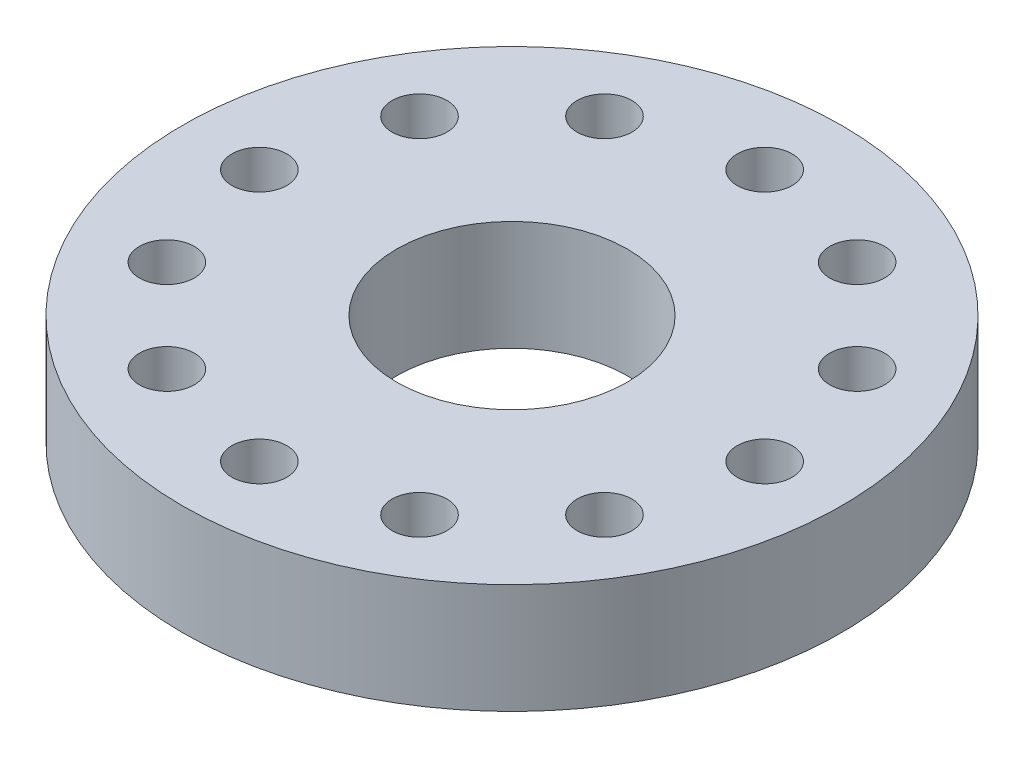
ISO-10303-21;
HEADER;
FILE_DESCRIPTION(('STEP AP214'),'2;1');
FILE_NAME('part.step','',(''),(''),'','','');
FILE_SCHEMA(('AUTOMOTIVE_DESIGN { 1 0 10303 214 1 1 1 1 }'));
ENDSEC;
DATA;
#1=APPLICATION_CONTEXT('core data for automotive mechanical design processes');
#2=APPLICATION_PROTOCOL_DEFINITION('international standard','automotive_design',2000,#1);
#3=PRODUCT_CONTEXT('',#1,'mechanical');
#4=PRODUCT('Part','Part','',(#3));
#5=PRODUCT_RELATED_PRODUCT_CATEGORY('part','',(#4));
#6=PRODUCT_DEFINITION_FORMATION('','',#4);
#7=PRODUCT_DEFINITION_CONTEXT('part definition',#1,'design');
#8=PRODUCT_DEFINITION('design','',#6,#7);
#9=PRODUCT_DEFINITION_SHAPE('','',#8);
#10=(LENGTH_UNIT() NAMED_UNIT(*) SI_UNIT(.MILLI.,.METRE.));
#11=(NAMED_UNIT(*) PLANE_ANGLE_UNIT() SI_UNIT($,.RADIAN.));
#12=(NAMED_UNIT(*) SI_UNIT($,.STERADIAN.) SOLID_ANGLE_UNIT());
#13=UNCERTAINTY_MEASURE_WITH_UNIT(LENGTH_MEASURE(1.E-05),#10,'distance_accuracy_value','');
#14=(GEOMETRIC_REPRESENTATION_CONTEXT(3) GLOBAL_UNCERTAINTY_ASSIGNED_CONTEXT((#13)) GLOBAL_UNIT_ASSIGNED_CONTEXT((#10,
#11,#12)) REPRESENTATION_CONTEXT('',''));
#15=CARTESIAN_POINT('',(0.,0.,0.));
#16=DIRECTION('',(0.,0.,1.));
#17=DIRECTION('',(1.,0.,0.));
#18=AXIS2_PLACEMENT_3D('',#15,#16,#17);
#19=CARTESIAN_POINT('',(0.,10.,0.));
#20=DIRECTION('',(0.,1.,0.));
#21=DIRECTION('',(0.,0.,1.));
#22=AXIS2_PLACEMENT_3D('',#19,#20,#21);
#23=PLANE('',#22);
#24=CARTESIAN_POINT('',(-19.9185842870416,10.,-11.499999999999));
#25=DIRECTION('',(0.,1.,0.));
#26=DIRECTION('',(0.,0.,1.));
#27=AXIS2_PLACEMENT_3D('',#24,#25,#26);
#28=CIRCLE('',#27,2.5);
#29=CARTESIAN_POINT('',(-19.9185842870416,10.,-8.99999999999905));
#30=VERTEX_POINT('',#29);
#31=EDGE_CURVE('E109',#30,#30,#28,.T.);
#32=ORIENTED_EDGE('',*,*,#31,.F.);
#33=EDGE_LOOP('',(#32));
#34=FACE_BOUND('',#33,.T.);
#35=CARTESIAN_POINT('',(-19.9185842870405,10.,11.5000000000009));
#36=DIRECTION('',(0.,1.,0.));
#37=DIRECTION('',(0.,0.,1.));
#38=AXIS2_PLACEMENT_3D('',#35,#36,#37);
#39=CIRCLE('',#38,2.5);
#40=CARTESIAN_POINT('',(-19.9185842870405,10.,14.0000000000009));
#41=VERTEX_POINT('',#40);
#42=EDGE_CURVE('E97',#41,#41,#39,.T.);
#43=ORIENTED_EDGE('',*,*,#42,.F.);
#44=EDGE_LOOP('',(#43));
#45=FACE_BOUND('',#44,.T.);
#46=CARTESIAN_POINT('',(2.16458606171264E-12,10.,23.));
#47=DIRECTION('',(0.,1.,0.));
#48=DIRECTION('',(0.,0.,1.));
#49=AXIS2_PLACEMENT_3D('',#46,#47,#48);
#50=CIRCLE('',#49,2.5);
#51=CARTESIAN_POINT('',(2.16458606171264E-12,10.,25.5));
#52=VERTEX_POINT('',#51);
#53=EDGE_CURVE('E85',#52,#52,#50,.T.);
#54=ORIENTED_EDGE('',*,*,#53,.F.);
#55=EDGE_LOOP('',(#54));
#56=FACE_BOUND('',#55,.T.);
#57=CARTESIAN_POINT('',(19.9185842870437,10.,11.4999999999991));
#58=DIRECTION('',(0.,1.,0.));
#59=DIRECTION('',(0.,0.,1.));
#60=AXIS2_PLACEMENT_3D('',#57,#58,#59);
#61=CIRCLE('',#60,2.5);
#62=CARTESIAN_POINT('',(19.9185842870437,10.,13.9999999999991));
#63=VERTEX_POINT('',#62);
#64=EDGE_CURVE('E73',#63,#63,#61,.T.);
#65=ORIENTED_EDGE('',*,*,#64,.F.);
#66=EDGE_LOOP('',(#65));
#67=FACE_BOUND('',#66,.T.);
#68=CARTESIAN_POINT('',(19.9185842870426,10.,-11.5000000000009));
#69=DIRECTION('',(0.,1.,0.));
#70=DIRECTION('',(0.,0.,1.));
#71=AXIS2_PLACEMENT_3D('',#68,#69,#70);
#72=CIRCLE('',#71,2.49999999999999);
#73=CARTESIAN_POINT('',(19.9185842870426,10.,-9.00000000000095));
#74=VERTEX_POINT('',#73);
#75=EDGE_CURVE('E61',#74,#74,#72,.T.);
#76=ORIENTED_EDGE('',*,*,#75,.F.);
#77=EDGE_LOOP('',(#76));
#78=FACE_BOUND('',#77,.T.);
#79=CARTESIAN_POINT('',(0.,10.,0.));
#80=DIRECTION('',(0.,1.,0.));
#81=DIRECTION('',(0.,0.,1.));
#82=AXIS2_PLACEMENT_3D('',#79,#80,#81);
#83=CIRCLE('',#82,10.5);
#84=CARTESIAN_POINT('',(0.,10.,10.5));
#85=VERTEX_POINT('',#84);
#86=EDGE_CURVE('E49',#85,#85,#83,.T.);
#87=ORIENTED_EDGE('',*,*,#86,.F.);
#88=EDGE_LOOP('',(#87));
#89=FACE_BOUND('',#88,.T.);
#90=CARTESIAN_POINT('',(0.,10.,0.));
#91=DIRECTION('',(0.,1.,0.));
#92=DIRECTION('',(0.,0.,1.));
#93=AXIS2_PLACEMENT_3D('',#90,#91,#92);
#94=CIRCLE('',#93,30.);
#95=CARTESIAN_POINT('',(0.,10.,30.));
#96=VERTEX_POINT('',#95);
#97=EDGE_CURVE('E10',#96,#96,#94,.T.);
#98=ORIENTED_EDGE('',*,*,#97,.T.);
#99=EDGE_LOOP('',(#98));
#100=FACE_BOUND('',#99,.T.);
#101=CARTESIAN_POINT('',(0.,10.,-23.));
#102=DIRECTION('',(0.,1.,0.));
#103=DIRECTION('',(0.,0.,1.));
#104=AXIS2_PLACEMENT_3D('',#101,#102,#103);
#105=CIRCLE('',#104,2.5);
#106=CARTESIAN_POINT('',(0.,10.,-20.5));
#107=VERTEX_POINT('',#106);
#108=EDGE_CURVE('E44',#107,#107,#105,.T.);
#109=ORIENTED_EDGE('',*,*,#108,.F.);
#110=EDGE_LOOP('',(#109));
#111=FACE_BOUND('',#110,.T.);
#112=CARTESIAN_POINT('',(11.5000000000001,10.,-19.9185842870426));
#113=DIRECTION('',(0.,1.,0.));
#114=DIRECTION('',(0.,0.,1.));
#115=AXIS2_PLACEMENT_3D('',#112,#113,#114);
#116=CIRCLE('',#115,2.5);
#117=CARTESIAN_POINT('',(11.5000000000001,10.,-17.4185842870426));
#118=VERTEX_POINT('',#117);
#119=EDGE_CURVE('E55',#118,#118,#116,.T.);
#120=ORIENTED_EDGE('',*,*,#119,.F.);
#121=EDGE_LOOP('',(#120));
#122=FACE_BOUND('',#121,.T.);
#123=CARTESIAN_POINT('',(23.0000000000011,10.,-1.08229303085632E-12));
#124=DIRECTION('',(0.,1.,0.));
#125=DIRECTION('',(0.,0.,1.));
#126=AXIS2_PLACEMENT_3D('',#123,#124,#125);
#127=CIRCLE('',#126,2.5);
#128=CARTESIAN_POINT('',(23.0000000000011,10.,2.49999999999892));
#129=VERTEX_POINT('',#128);
#130=EDGE_CURVE('E67',#129,#129,#127,.T.);
#131=ORIENTED_EDGE('',*,*,#130,.F.);
#132=EDGE_LOOP('',(#131));
#133=FACE_BOUND('',#132,.T.);
#134=CARTESIAN_POINT('',(11.500000000002,10.,19.9185842870415));
#135=DIRECTION('',(0.,1.,0.));
#136=DIRECTION('',(0.,0.,1.));
#137=AXIS2_PLACEMENT_3D('',#134,#135,#136);
#138=CIRCLE('',#137,2.5);
#139=CARTESIAN_POINT('',(11.500000000002,10.,22.4185842870415));
#140=VERTEX_POINT('',#139);
#141=EDGE_CURVE('E79',#140,#140,#138,.T.);
#142=ORIENTED_EDGE('',*,*,#141,.F.);
#143=EDGE_LOOP('',(#142));
#144=FACE_BOUND('',#143,.T.);
#145=CARTESIAN_POINT('',(-11.499999999998,10.,19.9185842870426));
#146=DIRECTION('',(0.,1.,0.));
#147=DIRECTION('',(0.,0.,1.));
#148=AXIS2_PLACEMENT_3D('',#145,#146,#147);
#149=CIRCLE('',#148,2.5);
#150=CARTESIAN_POINT('',(-11.499999999998,10.,22.4185842870426));
#151=VERTEX_POINT('',#150);
#152=EDGE_CURVE('E91',#151,#151,#149,.T.);
#153=ORIENTED_EDGE('',*,*,#152,.F.);
#154=EDGE_LOOP('',(#153));
#155=FACE_BOUND('',#154,.T.);
#156=CARTESIAN_POINT('',(-22.9999999999989,10.,1.08510971849436E-12));
#157=DIRECTION('',(0.,1.,0.));
#158=DIRECTION('',(0.,0.,1.));
#159=AXIS2_PLACEMENT_3D('',#156,#157,#158);
#160=CIRCLE('',#159,2.5);
#161=CARTESIAN_POINT('',(-22.9999999999989,10.,2.50000000000108));
#162=VERTEX_POINT('',#161);
#163=EDGE_CURVE('E103',#162,#162,#160,.T.);
#164=ORIENTED_EDGE('',*,*,#163,.F.);
#165=EDGE_LOOP('',(#164));
#166=FACE_BOUND('',#165,.T.);
#167=CARTESIAN_POINT('',(-11.4999999999999,10.,-19.9185842870415));
#168=DIRECTION('',(0.,1.,0.));
#169=DIRECTION('',(0.,0.,1.));
#170=AXIS2_PLACEMENT_3D('',#167,#168,#169);
#171=CIRCLE('',#170,2.5);
#172=CARTESIAN_POINT('',(-11.4999999999999,10.,-17.4185842870415));
#173=VERTEX_POINT('',#172);
#174=EDGE_CURVE('E115',#173,#173,#171,.T.);
#175=ORIENTED_EDGE('',*,*,#174,.F.);
#176=EDGE_LOOP('',(#175));
#177=FACE_BOUND('',#176,.T.);
#178=ADVANCED_FACE('F33',(#34,#45,#56,#67,#78,#89,#100,#111,#122,#133,#144,#155,#166,#177),#23,.T.);
#179=CARTESIAN_POINT('',(0.,0.,0.));
#180=DIRECTION('',(0.,1.,0.));
#181=DIRECTION('',(0.,0.,1.));
#182=AXIS2_PLACEMENT_3D('',#179,#180,#181);
#183=PLANE('',#182);
#184=CARTESIAN_POINT('',(0.,0.,0.));
#185=DIRECTION('',(0.,1.,0.));
#186=DIRECTION('',(0.,0.,1.));
#187=AXIS2_PLACEMENT_3D('',#184,#185,#186);
#188=CIRCLE('',#187,30.);
#189=CARTESIAN_POINT('',(0.,0.,30.));
#190=VERTEX_POINT('',#189);
#191=EDGE_CURVE('E37',#190,#190,#188,.T.);
#192=ORIENTED_EDGE('',*,*,#191,.F.);
#193=EDGE_LOOP('',(#192));
#194=FACE_BOUND('',#193,.T.);
#195=CARTESIAN_POINT('',(0.,0.,-23.));
#196=DIRECTION('',(0.,1.,0.));
#197=DIRECTION('',(0.,0.,1.));
#198=AXIS2_PLACEMENT_3D('',#195,#196,#197);
#199=CIRCLE('',#198,2.5);
#200=CARTESIAN_POINT('',(0.,0.,-20.5));
#201=VERTEX_POINT('',#200);
#202=EDGE_CURVE('E46',#201,#201,#199,.T.);
#203=ORIENTED_EDGE('',*,*,#202,.T.);
#204=EDGE_LOOP('',(#203));
#205=FACE_BOUND('',#204,.T.);
#206=CARTESIAN_POINT('',(0.,0.,0.));
#207=DIRECTION('',(0.,1.,0.));
#208=DIRECTION('',(0.,0.,1.));
#209=AXIS2_PLACEMENT_3D('',#206,#207,#208);
#210=CIRCLE('',#209,10.5);
#211=CARTESIAN_POINT('',(0.,0.,10.5));
#212=VERTEX_POINT('',#211);
#213=EDGE_CURVE('E52',#212,#212,#210,.T.);
#214=ORIENTED_EDGE('',*,*,#213,.T.);
#215=EDGE_LOOP('',(#214));
#216=FACE_BOUND('',#215,.T.);
#217=CARTESIAN_POINT('',(11.5000000000001,0.,-19.9185842870426));
#218=DIRECTION('',(0.,1.,0.));
#219=DIRECTION('',(0.,0.,1.));
#220=AXIS2_PLACEMENT_3D('',#217,#218,#219);
#221=CIRCLE('',#220,2.5);
#222=CARTESIAN_POINT('',(11.5000000000001,0.,-17.4185842870426));
#223=VERTEX_POINT('',#222);
#224=EDGE_CURVE('E58',#223,#223,#221,.T.);
#225=ORIENTED_EDGE('',*,*,#224,.T.);
#226=EDGE_LOOP('',(#225));
#227=FACE_BOUND('',#226,.T.);
#228=CARTESIAN_POINT('',(19.9185842870426,0.,-11.5000000000009));
#229=DIRECTION('',(0.,1.,0.));
#230=DIRECTION('',(0.,0.,1.));
#231=AXIS2_PLACEMENT_3D('',#228,#229,#230);
#232=CIRCLE('',#231,2.49999999999999);
#233=CARTESIAN_POINT('',(19.9185842870426,0.,-9.00000000000095));
#234=VERTEX_POINT('',#233);
#235=EDGE_CURVE('E64',#234,#234,#232,.T.);
#236=ORIENTED_EDGE('',*,*,#235,.T.);
#237=EDGE_LOOP('',(#236));
#238=FACE_BOUND('',#237,.T.);
#239=CARTESIAN_POINT('',(23.0000000000011,0.,-1.08229303085632E-12));
#240=DIRECTION('',(0.,1.,0.));
#241=DIRECTION('',(0.,0.,1.));
#242=AXIS2_PLACEMENT_3D('',#239,#240,#241);
#243=CIRCLE('',#242,2.5);
#244=CARTESIAN_POINT('',(23.0000000000011,0.,2.49999999999892));
#245=VERTEX_POINT('',#244);
#246=EDGE_CURVE('E70',#245,#245,#243,.T.);
#247=ORIENTED_EDGE('',*,*,#246,.T.);
#248=EDGE_LOOP('',(#247));
#249=FACE_BOUND('',#248,.T.);
#250=CARTESIAN_POINT('',(19.9185842870437,0.,11.4999999999991));
#251=DIRECTION('',(0.,1.,0.));
#252=DIRECTION('',(0.,0.,1.));
#253=AXIS2_PLACEMENT_3D('',#250,#251,#252);
#254=CIRCLE('',#253,2.5);
#255=CARTESIAN_POINT('',(19.9185842870437,0.,13.9999999999991));
#256=VERTEX_POINT('',#255);
#257=EDGE_CURVE('E76',#256,#256,#254,.T.);
#258=ORIENTED_EDGE('',*,*,#257,.T.);
#259=EDGE_LOOP('',(#258));
#260=FACE_BOUND('',#259,.T.);
#261=CARTESIAN_POINT('',(11.500000000002,0.,19.9185842870415));
#262=DIRECTION('',(0.,1.,0.));
#263=DIRECTION('',(0.,0.,1.));
#264=AXIS2_PLACEMENT_3D('',#261,#262,#263);
#265=CIRCLE('',#264,2.5);
#266=CARTESIAN_POINT('',(11.500000000002,0.,22.4185842870415));
#267=VERTEX_POINT('',#266);
#268=EDGE_CURVE('E82',#267,#267,#265,.T.);
#269=ORIENTED_EDGE('',*,*,#268,.T.);
#270=EDGE_LOOP('',(#269));
#271=FACE_BOUND('',#270,.T.);
#272=CARTESIAN_POINT('',(2.16458606171264E-12,0.,23.));
#273=DIRECTION('',(0.,1.,0.));
#274=DIRECTION('',(0.,0.,1.));
#275=AXIS2_PLACEMENT_3D('',#272,#273,#274);
#276=CIRCLE('',#275,2.5);
#277=CARTESIAN_POINT('',(2.16458606171264E-12,0.,25.5));
#278=VERTEX_POINT('',#277);
#279=EDGE_CURVE('E88',#278,#278,#276,.T.);
#280=ORIENTED_EDGE('',*,*,#279,.T.);
#281=EDGE_LOOP('',(#280));
#282=FACE_BOUND('',#281,.T.);
#283=CARTESIAN_POINT('',(-11.499999999998,0.,19.9185842870426));
#284=DIRECTION('',(0.,1.,0.));
#285=DIRECTION('',(0.,0.,1.));
#286=AXIS2_PLACEMENT_3D('',#283,#284,#285);
#287=CIRCLE('',#286,2.5);
#288=CARTESIAN_POINT('',(-11.499999999998,0.,22.4185842870426));
#289=VERTEX_POINT('',#288);
#290=EDGE_CURVE('E94',#289,#289,#287,.T.);
#291=ORIENTED_EDGE('',*,*,#290,.T.);
#292=EDGE_LOOP('',(#291));
#293=FACE_BOUND('',#292,.T.);
#294=CARTESIAN_POINT('',(-19.9185842870405,0.,11.5000000000009));
#295=DIRECTION('',(0.,1.,0.));
#296=DIRECTION('',(0.,0.,1.));
#297=AXIS2_PLACEMENT_3D('',#294,#295,#296);
#298=CIRCLE('',#297,2.5);
#299=CARTESIAN_POINT('',(-19.9185842870405,0.,14.0000000000009));
#300=VERTEX_POINT('',#299);
#301=EDGE_CURVE('E100',#300,#300,#298,.T.);
#302=ORIENTED_EDGE('',*,*,#301,.T.);
#303=EDGE_LOOP('',(#302));
#304=FACE_BOUND('',#303,.T.);
#305=CARTESIAN_POINT('',(-22.9999999999989,0.,1.08510971849436E-12));
#306=DIRECTION('',(0.,1.,0.));
#307=DIRECTION('',(0.,0.,1.));
#308=AXIS2_PLACEMENT_3D('',#305,#306,#307);
#309=CIRCLE('',#308,2.5);
#310=CARTESIAN_POINT('',(-22.9999999999989,0.,2.50000000000108));
#311=VERTEX_POINT('',#310);
#312=EDGE_CURVE('E106',#311,#311,#309,.T.);
#313=ORIENTED_EDGE('',*,*,#312,.T.);
#314=EDGE_LOOP('',(#313));
#315=FACE_BOUND('',#314,.T.);
#316=CARTESIAN_POINT('',(-19.9185842870416,0.,-11.499999999999));
#317=DIRECTION('',(0.,1.,0.));
#318=DIRECTION('',(0.,0.,1.));
#319=AXIS2_PLACEMENT_3D('',#316,#317,#318);
#320=CIRCLE('',#319,2.5);
#321=CARTESIAN_POINT('',(-19.9185842870416,0.,-8.99999999999905));
#322=VERTEX_POINT('',#321);
#323=EDGE_CURVE('E112',#322,#322,#320,.T.);
#324=ORIENTED_EDGE('',*,*,#323,.T.);
#325=EDGE_LOOP('',(#324));
#326=FACE_BOUND('',#325,.T.);
#327=CARTESIAN_POINT('',(-11.4999999999999,0.,-19.9185842870415));
#328=DIRECTION('',(0.,1.,0.));
#329=DIRECTION('',(0.,0.,1.));
#330=AXIS2_PLACEMENT_3D('',#327,#328,#329);
#331=CIRCLE('',#330,2.5);
#332=CARTESIAN_POINT('',(-11.4999999999999,0.,-17.4185842870415));
#333=VERTEX_POINT('',#332);
#334=EDGE_CURVE('E118',#333,#333,#331,.T.);
#335=ORIENTED_EDGE('',*,*,#334,.T.);
#336=EDGE_LOOP('',(#335));
#337=FACE_BOUND('',#336,.T.);
#338=ADVANCED_FACE('F128',(#194,#205,#216,#227,#238,#249,#260,#271,#282,#293,#304,#315,#326,
#337),#183,.F.);
#339=CARTESIAN_POINT('',(0.,10.,0.));
#340=DIRECTION('',(0.,-1.,0.));
#341=DIRECTION('',(0.,0.,-1.));
#342=AXIS2_PLACEMENT_3D('',#339,#340,#341);
#343=CYLINDRICAL_SURFACE('',#342,30.);
#344=ORIENTED_EDGE('',*,*,#97,.F.);
#345=EDGE_LOOP('',(#344));
#346=FACE_BOUND('',#345,.T.);
#347=ORIENTED_EDGE('',*,*,#191,.T.);
#348=EDGE_LOOP('',(#347));
#349=FACE_BOUND('',#348,.T.);
#350=ADVANCED_FACE('F35',(#346,#349),#343,.T.);
#351=CARTESIAN_POINT('',(0.,10.,-23.));
#352=DIRECTION('',(0.,-1.,0.));
#353=DIRECTION('',(0.,0.,-1.));
#354=AXIS2_PLACEMENT_3D('',#351,#352,#353);
#355=CYLINDRICAL_SURFACE('',#354,2.5);
#356=ORIENTED_EDGE('',*,*,#108,.T.);
#357=EDGE_LOOP('',(#356));
#358=FACE_BOUND('',#357,.T.);
#359=ORIENTED_EDGE('',*,*,#202,.F.);
#360=EDGE_LOOP('',(#359));
#361=FACE_BOUND('',#360,.T.);
#362=ADVANCED_FACE('F138',(#358,#361),#355,.F.);
#363=CARTESIAN_POINT('',(0.,10.,0.));
#364=DIRECTION('',(0.,-1.,0.));
#365=DIRECTION('',(0.,0.,-1.));
#366=AXIS2_PLACEMENT_3D('',#363,#364,#365);
#367=CYLINDRICAL_SURFACE('',#366,10.5);
#368=ORIENTED_EDGE('',*,*,#86,.T.);
#369=EDGE_LOOP('',(#368));
#370=FACE_BOUND('',#369,.T.);
#371=ORIENTED_EDGE('',*,*,#213,.F.);
#372=EDGE_LOOP('',(#371));
#373=FACE_BOUND('',#372,.T.);
#374=ADVANCED_FACE('F141',(#370,#373),#367,.F.);
#375=CARTESIAN_POINT('',(11.5000000000001,10.,-19.9185842870426));
#376=DIRECTION('',(0.,-1.,0.));
#377=DIRECTION('',(0.,0.,-1.));
#378=AXIS2_PLACEMENT_3D('',#375,#376,#377);
#379=CYLINDRICAL_SURFACE('',#378,2.5);
#380=ORIENTED_EDGE('',*,*,#119,.T.);
#381=EDGE_LOOP('',(#380));
#382=FACE_BOUND('',#381,.T.);
#383=ORIENTED_EDGE('',*,*,#224,.F.);
#384=EDGE_LOOP('',(#383));
#385=FACE_BOUND('',#384,.T.);
#386=ADVANCED_FACE('F145',(#382,#385),#379,.F.);
#387=CARTESIAN_POINT('',(19.9185842870426,10.,-11.5000000000009));
#388=DIRECTION('',(0.,-1.,0.));
#389=DIRECTION('',(0.,0.,-1.));
#390=AXIS2_PLACEMENT_3D('',#387,#388,#389);
#391=CYLINDRICAL_SURFACE('',#390,2.49999999999999);
#392=ORIENTED_EDGE('',*,*,#75,.T.);
#393=EDGE_LOOP('',(#392));
#394=FACE_BOUND('',#393,.T.);
#395=ORIENTED_EDGE('',*,*,#235,.F.);
#396=EDGE_LOOP('',(#395));
#397=FACE_BOUND('',#396,.T.);
#398=ADVANCED_FACE('F149',(#394,#397),#391,.F.);
#399=CARTESIAN_POINT('',(23.0000000000011,10.,-1.08229303085632E-12));
#400=DIRECTION('',(0.,-1.,0.));
#401=DIRECTION('',(0.,0.,-1.));
#402=AXIS2_PLACEMENT_3D('',#399,#400,#401);
#403=CYLINDRICAL_SURFACE('',#402,2.5);
#404=ORIENTED_EDGE('',*,*,#130,.T.);
#405=EDGE_LOOP('',(#404));
#406=FACE_BOUND('',#405,.T.);
#407=ORIENTED_EDGE('',*,*,#246,.F.);
#408=EDGE_LOOP('',(#407));
#409=FACE_BOUND('',#408,.T.);
#410=ADVANCED_FACE('F153',(#406,#409),#403,.F.);
#411=CARTESIAN_POINT('',(19.9185842870437,10.,11.4999999999991));
#412=DIRECTION('',(0.,-1.,0.));
#413=DIRECTION('',(0.,0.,-1.));
#414=AXIS2_PLACEMENT_3D('',#411,#412,#413);
#415=CYLINDRICAL_SURFACE('',#414,2.5);
#416=ORIENTED_EDGE('',*,*,#64,.T.);
#417=EDGE_LOOP('',(#416));
#418=FACE_BOUND('',#417,.T.);
#419=ORIENTED_EDGE('',*,*,#257,.F.);
#420=EDGE_LOOP('',(#419));
#421=FACE_BOUND('',#420,.T.);
#422=ADVANCED_FACE('F157',(#418,#421),#415,.F.);
#423=CARTESIAN_POINT('',(11.500000000002,10.,19.9185842870415));
#424=DIRECTION('',(0.,-1.,0.));
#425=DIRECTION('',(0.,0.,-1.));
#426=AXIS2_PLACEMENT_3D('',#423,#424,#425);
#427=CYLINDRICAL_SURFACE('',#426,2.5);
#428=ORIENTED_EDGE('',*,*,#141,.T.);
#429=EDGE_LOOP('',(#428));
#430=FACE_BOUND('',#429,.T.);
#431=ORIENTED_EDGE('',*,*,#268,.F.);
#432=EDGE_LOOP('',(#431));
#433=FACE_BOUND('',#432,.T.);
#434=ADVANCED_FACE('F161',(#430,#433),#427,.F.);
#435=CARTESIAN_POINT('',(2.16458606171264E-12,10.,23.));
#436=DIRECTION('',(0.,-1.,0.));
#437=DIRECTION('',(0.,0.,-1.));
#438=AXIS2_PLACEMENT_3D('',#435,#436,#437);
#439=CYLINDRICAL_SURFACE('',#438,2.5);
#440=ORIENTED_EDGE('',*,*,#53,.T.);
#441=EDGE_LOOP('',(#440));
#442=FACE_BOUND('',#441,.T.);
#443=ORIENTED_EDGE('',*,*,#279,.F.);
#444=EDGE_LOOP('',(#443));
#445=FACE_BOUND('',#444,.T.);
#446=ADVANCED_FACE('F165',(#442,#445),#439,.F.);
#447=CARTESIAN_POINT('',(-11.499999999998,10.,19.9185842870426));
#448=DIRECTION('',(0.,-1.,0.));
#449=DIRECTION('',(0.,0.,-1.));
#450=AXIS2_PLACEMENT_3D('',#447,#448,#449);
#451=CYLINDRICAL_SURFACE('',#450,2.5);
#452=ORIENTED_EDGE('',*,*,#152,.T.);
#453=EDGE_LOOP('',(#452));
#454=FACE_BOUND('',#453,.T.);
#455=ORIENTED_EDGE('',*,*,#290,.F.);
#456=EDGE_LOOP('',(#455));
#457=FACE_BOUND('',#456,.T.);
#458=ADVANCED_FACE('F169',(#454,#457),#451,.F.);
#459=CARTESIAN_POINT('',(-19.9185842870405,10.,11.5000000000009));
#460=DIRECTION('',(0.,-1.,0.));
#461=DIRECTION('',(0.,0.,-1.));
#462=AXIS2_PLACEMENT_3D('',#459,#460,#461);
#463=CYLINDRICAL_SURFACE('',#462,2.5);
#464=ORIENTED_EDGE('',*,*,#42,.T.);
#465=EDGE_LOOP('',(#464));
#466=FACE_BOUND('',#465,.T.);
#467=ORIENTED_EDGE('',*,*,#301,.F.);
#468=EDGE_LOOP('',(#467));
#469=FACE_BOUND('',#468,.T.);
#470=ADVANCED_FACE('F173',(#466,#469),#463,.F.);
#471=CARTESIAN_POINT('',(-22.9999999999989,10.,1.08510971849436E-12));
#472=DIRECTION('',(0.,-1.,0.));
#473=DIRECTION('',(0.,0.,-1.));
#474=AXIS2_PLACEMENT_3D('',#471,#472,#473);
#475=CYLINDRICAL_SURFACE('',#474,2.5);
#476=ORIENTED_EDGE('',*,*,#163,.T.);
#477=EDGE_LOOP('',(#476));
#478=FACE_BOUND('',#477,.T.);
#479=ORIENTED_EDGE('',*,*,#312,.F.);
#480=EDGE_LOOP('',(#479));
#481=FACE_BOUND('',#480,.T.);
#482=ADVANCED_FACE('F177',(#478,#481),#475,.F.);
#483=CARTESIAN_POINT('',(-19.9185842870416,10.,-11.499999999999));
#484=DIRECTION('',(0.,-1.,0.));
#485=DIRECTION('',(0.,0.,-1.));
#486=AXIS2_PLACEMENT_3D('',#483,#484,#485);
#487=CYLINDRICAL_SURFACE('',#486,2.5);
#488=ORIENTED_EDGE('',*,*,#31,.T.);
#489=EDGE_LOOP('',(#488));
#490=FACE_BOUND('',#489,.T.);
#491=ORIENTED_EDGE('',*,*,#323,.F.);
#492=EDGE_LOOP('',(#491));
#493=FACE_BOUND('',#492,.T.);
#494=ADVANCED_FACE('F181',(#490,#493),#487,.F.);
#495=CARTESIAN_POINT('',(-11.4999999999999,10.,-19.9185842870415));
#496=DIRECTION('',(0.,-1.,0.));
#497=DIRECTION('',(0.,0.,-1.));
#498=AXIS2_PLACEMENT_3D('',#495,#496,#497);
#499=CYLINDRICAL_SURFACE('',#498,2.5);
#500=ORIENTED_EDGE('',*,*,#174,.T.);
#501=EDGE_LOOP('',(#500));
#502=FACE_BOUND('',#501,.T.);
#503=ORIENTED_EDGE('',*,*,#334,.F.);
#504=EDGE_LOOP('',(#503));
#505=FACE_BOUND('',#504,.T.);
#506=ADVANCED_FACE('F124',(#502,#505),#499,.F.);
#507=CLOSED_SHELL('',(#178,#338,#350,#362,#374,#386,#398,#410,#422,#434,#446,#458,#470,#482,
#494,#506));
#508=MANIFOLD_SOLID_BREP('B2',#507);
#509=ADVANCED_BREP_SHAPE_REPRESENTATION('',(#18,#508),#14);
#510=SHAPE_DEFINITION_REPRESENTATION(#9,#509);
ENDSEC;
END-ISO-10303-21;
